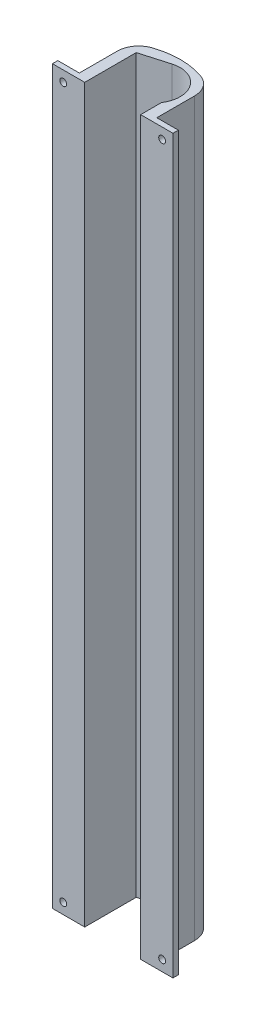
ISO-10303-21;
HEADER;
FILE_DESCRIPTION(('STEP AP214'),'2;1');
FILE_NAME('part.step','',(''),(''),'','','');
FILE_SCHEMA(('AUTOMOTIVE_DESIGN { 1 0 10303 214 1 1 1 1 }'));
ENDSEC;
DATA;
#1=APPLICATION_CONTEXT('core data for automotive mechanical design processes');
#2=APPLICATION_PROTOCOL_DEFINITION('international standard','automotive_design',2000,#1);
#3=PRODUCT_CONTEXT('',#1,'mechanical');
#4=PRODUCT('Part','Part','',(#3));
#5=PRODUCT_RELATED_PRODUCT_CATEGORY('part','',(#4));
#6=PRODUCT_DEFINITION_FORMATION('','',#4);
#7=PRODUCT_DEFINITION_CONTEXT('part definition',#1,'design');
#8=PRODUCT_DEFINITION('design','',#6,#7);
#9=PRODUCT_DEFINITION_SHAPE('','',#8);
#10=(LENGTH_UNIT() NAMED_UNIT(*) SI_UNIT(.MILLI.,.METRE.));
#11=(NAMED_UNIT(*) PLANE_ANGLE_UNIT() SI_UNIT($,.RADIAN.));
#12=(NAMED_UNIT(*) SI_UNIT($,.STERADIAN.) SOLID_ANGLE_UNIT());
#13=UNCERTAINTY_MEASURE_WITH_UNIT(LENGTH_MEASURE(1.E-05),#10,'distance_accuracy_value','');
#14=(GEOMETRIC_REPRESENTATION_CONTEXT(3) GLOBAL_UNCERTAINTY_ASSIGNED_CONTEXT((#13)) GLOBAL_UNIT_ASSIGNED_CONTEXT((#10,
#11,#12)) REPRESENTATION_CONTEXT('',''));
#15=CARTESIAN_POINT('',(0.,0.,0.));
#16=DIRECTION('',(0.,0.,1.));
#17=DIRECTION('',(1.,0.,0.));
#18=AXIS2_PLACEMENT_3D('',#15,#16,#17);
#19=CARTESIAN_POINT('',(0.,431.8,74.9201803451045));
#20=DIRECTION('',(0.,-1.,0.));
#21=DIRECTION('',(0.,0.,-1.));
#22=AXIS2_PLACEMENT_3D('',#19,#20,#21);
#23=CYLINDRICAL_SURFACE('',#22,14.9862811380157);
#24=CARTESIAN_POINT('',(0.,0.,74.9201803451045));
#25=DIRECTION('',(0.,-1.,0.));
#26=DIRECTION('',(0.,0.,-1.));
#27=AXIS2_PLACEMENT_3D('',#24,#25,#26);
#28=CIRCLE('',#27,14.9862811380157);
#29=CARTESIAN_POINT('',(-4.16201958345776,0.,60.5234371253843));
#30=VERTEX_POINT('',#29);
#31=CARTESIAN_POINT('',(12.446,0.,83.2679768416446));
#32=VERTEX_POINT('',#31);
#33=EDGE_CURVE('E168',#30,#32,#28,.T.);
#34=ORIENTED_EDGE('',*,*,#33,.T.);
#35=DIRECTION('',(0.,-1.,0.));
#36=VECTOR('',#35,1.);
#37=CARTESIAN_POINT('',(12.446,431.8,83.2679768416446));
#38=LINE('',#37,#36);
#39=CARTESIAN_POINT('',(12.446,431.8,83.2679768416446));
#40=VERTEX_POINT('',#39);
#41=EDGE_CURVE('E150',#40,#32,#38,.T.);
#42=ORIENTED_EDGE('',*,*,#41,.F.);
#43=CARTESIAN_POINT('',(0.,431.8,74.9201803451045));
#44=DIRECTION('',(0.,-1.,0.));
#45=DIRECTION('',(0.,0.,-1.));
#46=AXIS2_PLACEMENT_3D('',#43,#44,#45);
#47=CIRCLE('',#46,14.9862811380157);
#48=CARTESIAN_POINT('',(-4.16201958345776,431.8,60.5234371253843));
#49=VERTEX_POINT('',#48);
#50=EDGE_CURVE('E156',#49,#40,#47,.T.);
#51=ORIENTED_EDGE('',*,*,#50,.F.);
#52=DIRECTION('',(0.,-1.,0.));
#53=VECTOR('',#52,1.);
#54=CARTESIAN_POINT('',(-4.16201958345776,431.8,60.5234371253843));
#55=LINE('',#54,#53);
#56=EDGE_CURVE('E227',#49,#30,#55,.T.);
#57=ORIENTED_EDGE('',*,*,#56,.T.);
#58=EDGE_LOOP('',(#34,#42,#51,#57));
#59=FACE_BOUND('',#58,.T.);
#60=ADVANCED_FACE('F36',(#59),#23,.F.);
#61=CARTESIAN_POINT('',(12.446,431.8,95.666893232235));
#62=DIRECTION('',(1.,0.,0.));
#63=DIRECTION('',(0.,0.,-1.));
#64=AXIS2_PLACEMENT_3D('',#61,#62,#63);
#65=PLANE('',#64);
#66=DIRECTION('',(0.,0.,1.));
#67=VECTOR('',#66,1.);
#68=CARTESIAN_POINT('',(12.446,0.,95.666893232235));
#69=LINE('',#68,#67);
#70=CARTESIAN_POINT('',(12.446,0.,95.666893232235));
#71=VERTEX_POINT('',#70);
#72=EDGE_CURVE('E258',#32,#71,#69,.T.);
#73=ORIENTED_EDGE('',*,*,#72,.T.);
#74=DIRECTION('',(0.,-1.,0.));
#75=VECTOR('',#74,1.);
#76=CARTESIAN_POINT('',(12.446,431.8,95.666893232235));
#77=LINE('',#76,#75);
#78=CARTESIAN_POINT('',(12.446,431.8,95.666893232235));
#79=VERTEX_POINT('',#78);
#80=EDGE_CURVE('E153',#79,#71,#77,.T.);
#81=ORIENTED_EDGE('',*,*,#80,.F.);
#82=DIRECTION('',(0.,0.,1.));
#83=VECTOR('',#82,1.);
#84=CARTESIAN_POINT('',(12.446,431.8,95.666893232235));
#85=LINE('',#84,#83);
#86=EDGE_CURVE('E146',#40,#79,#85,.T.);
#87=ORIENTED_EDGE('',*,*,#86,.F.);
#88=ORIENTED_EDGE('',*,*,#41,.T.);
#89=EDGE_LOOP('',(#73,#81,#87,#88));
#90=FACE_BOUND('',#89,.T.);
#91=ADVANCED_FACE('F148',(#90),#65,.F.);
#92=CARTESIAN_POINT('',(12.446,431.8,95.666893232235));
#93=DIRECTION('',(0.,0.,-1.));
#94=DIRECTION('',(-1.,0.,0.));
#95=AXIS2_PLACEMENT_3D('',#92,#93,#94);
#96=PLANE('',#95);
#97=CARTESIAN_POINT('',(25.146,6.35,95.666893232235));
#98=DIRECTION('',(0.,0.,-1.));
#99=DIRECTION('',(-1.,0.,0.));
#100=AXIS2_PLACEMENT_3D('',#97,#98,#99);
#101=CIRCLE('',#100,2.03200000000001);
#102=CARTESIAN_POINT('',(23.114,6.35,95.666893232235));
#103=VERTEX_POINT('',#102);
#104=EDGE_CURVE('E282',#103,#103,#101,.T.);
#105=ORIENTED_EDGE('',*,*,#104,.T.);
#106=EDGE_LOOP('',(#105));
#107=FACE_BOUND('',#106,.T.);
#108=CARTESIAN_POINT('',(25.146,425.45,95.666893232235));
#109=DIRECTION('',(0.,0.,-1.));
#110=DIRECTION('',(-1.,0.,0.));
#111=AXIS2_PLACEMENT_3D('',#108,#109,#110);
#112=CIRCLE('',#111,2.03200000000002);
#113=CARTESIAN_POINT('',(23.114,425.45,95.666893232235));
#114=VERTEX_POINT('',#113);
#115=EDGE_CURVE('E263',#114,#114,#112,.T.);
#116=ORIENTED_EDGE('',*,*,#115,.T.);
#117=EDGE_LOOP('',(#116));
#118=FACE_BOUND('',#117,.T.);
#119=DIRECTION('',(1.,0.,0.));
#120=VECTOR('',#119,1.);
#121=CARTESIAN_POINT('',(12.446,0.,95.666893232235));
#122=LINE('',#121,#120);
#123=CARTESIAN_POINT('',(31.496,0.,95.666893232235));
#124=VERTEX_POINT('',#123);
#125=EDGE_CURVE('E257',#71,#124,#122,.T.);
#126=ORIENTED_EDGE('',*,*,#125,.T.);
#127=DIRECTION('',(0.,-1.,0.));
#128=VECTOR('',#127,1.);
#129=CARTESIAN_POINT('',(31.496,431.8,95.666893232235));
#130=LINE('',#129,#128);
#131=CARTESIAN_POINT('',(31.496,431.8,95.666893232235));
#132=VERTEX_POINT('',#131);
#133=EDGE_CURVE('E173',#132,#124,#130,.T.);
#134=ORIENTED_EDGE('',*,*,#133,.F.);
#135=DIRECTION('',(1.,0.,0.));
#136=VECTOR('',#135,1.);
#137=CARTESIAN_POINT('',(12.446,431.8,95.666893232235));
#138=LINE('',#137,#136);
#139=EDGE_CURVE('E155',#79,#132,#138,.T.);
#140=ORIENTED_EDGE('',*,*,#139,.F.);
#141=ORIENTED_EDGE('',*,*,#80,.T.);
#142=EDGE_LOOP('',(#126,#134,#140,#141));
#143=FACE_BOUND('',#142,.T.);
#144=ADVANCED_FACE('F349',(#107,#118,#143),#96,.F.);
#145=CARTESIAN_POINT('',(31.496,431.8,95.666893232235));
#146=DIRECTION('',(-1.,0.,0.));
#147=DIRECTION('',(0.,0.,1.));
#148=AXIS2_PLACEMENT_3D('',#145,#146,#147);
#149=PLANE('',#148);
#150=DIRECTION('',(0.,0.,-1.));
#151=VECTOR('',#150,1.);
#152=CARTESIAN_POINT('',(31.496,0.,95.666893232235));
#153=LINE('',#152,#151);
#154=CARTESIAN_POINT('',(31.496,0.,92.491893232235));
#155=VERTEX_POINT('',#154);
#156=EDGE_CURVE('E212',#124,#155,#153,.T.);
#157=ORIENTED_EDGE('',*,*,#156,.T.);
#158=DIRECTION('',(0.,-1.,0.));
#159=VECTOR('',#158,1.);
#160=CARTESIAN_POINT('',(31.496,431.8,92.491893232235));
#161=LINE('',#160,#159);
#162=CARTESIAN_POINT('',(31.496,431.8,92.491893232235));
#163=VERTEX_POINT('',#162);
#164=EDGE_CURVE('E245',#163,#155,#161,.T.);
#165=ORIENTED_EDGE('',*,*,#164,.F.);
#166=DIRECTION('',(0.,0.,-1.));
#167=VECTOR('',#166,1.);
#168=CARTESIAN_POINT('',(31.496,431.8,95.666893232235));
#169=LINE('',#168,#167);
#170=EDGE_CURVE('E254',#132,#163,#169,.T.);
#171=ORIENTED_EDGE('',*,*,#170,.F.);
#172=ORIENTED_EDGE('',*,*,#133,.T.);
#173=EDGE_LOOP('',(#157,#165,#171,#172));
#174=FACE_BOUND('',#173,.T.);
#175=ADVANCED_FACE('F252',(#174),#149,.F.);
#176=CARTESIAN_POINT('',(31.496,431.8,92.491893232235));
#177=DIRECTION('',(0.,0.,1.));
#178=DIRECTION('',(1.,0.,0.));
#179=AXIS2_PLACEMENT_3D('',#176,#177,#178);
#180=PLANE('',#179);
#181=CARTESIAN_POINT('',(25.146,6.35,92.491893232235));
#182=DIRECTION('',(0.,0.,-1.));
#183=DIRECTION('',(-1.,0.,0.));
#184=AXIS2_PLACEMENT_3D('',#181,#182,#183);
#185=CIRCLE('',#184,2.03200000000001);
#186=CARTESIAN_POINT('',(23.114,6.35,92.491893232235));
#187=VERTEX_POINT('',#186);
#188=EDGE_CURVE('E292',#187,#187,#185,.T.);
#189=ORIENTED_EDGE('',*,*,#188,.F.);
#190=EDGE_LOOP('',(#189));
#191=FACE_BOUND('',#190,.T.);
#192=CARTESIAN_POINT('',(25.146,425.45,92.491893232235));
#193=DIRECTION('',(0.,0.,-1.));
#194=DIRECTION('',(-1.,0.,0.));
#195=AXIS2_PLACEMENT_3D('',#192,#193,#194);
#196=CIRCLE('',#195,2.03200000000002);
#197=CARTESIAN_POINT('',(23.114,425.45,92.491893232235));
#198=VERTEX_POINT('',#197);
#199=EDGE_CURVE('E279',#198,#198,#196,.T.);
#200=ORIENTED_EDGE('',*,*,#199,.F.);
#201=EDGE_LOOP('',(#200));
#202=FACE_BOUND('',#201,.T.);
#203=DIRECTION('',(-1.,0.,0.));
#204=VECTOR('',#203,1.);
#205=CARTESIAN_POINT('',(31.496,0.,92.491893232235));
#206=LINE('',#205,#204);
#207=CARTESIAN_POINT('',(18.796,0.,92.491893232235));
#208=VERTEX_POINT('',#207);
#209=EDGE_CURVE('E208',#155,#208,#206,.T.);
#210=ORIENTED_EDGE('',*,*,#209,.T.);
#211=DIRECTION('',(0.,-1.,0.));
#212=VECTOR('',#211,1.);
#213=CARTESIAN_POINT('',(18.796,431.8,92.491893232235));
#214=LINE('',#213,#212);
#215=CARTESIAN_POINT('',(18.796,431.8,92.491893232235));
#216=VERTEX_POINT('',#215);
#217=EDGE_CURVE('E207',#216,#208,#214,.T.);
#218=ORIENTED_EDGE('',*,*,#217,.F.);
#219=DIRECTION('',(-1.,0.,0.));
#220=VECTOR('',#219,1.);
#221=CARTESIAN_POINT('',(31.496,431.8,92.491893232235));
#222=LINE('',#221,#220);
#223=EDGE_CURVE('E275',#163,#216,#222,.T.);
#224=ORIENTED_EDGE('',*,*,#223,.F.);
#225=ORIENTED_EDGE('',*,*,#164,.T.);
#226=EDGE_LOOP('',(#210,#218,#224,#225));
#227=FACE_BOUND('',#226,.T.);
#228=ADVANCED_FACE('F357',(#191,#202,#227),#180,.F.);
#229=CARTESIAN_POINT('',(18.796,431.8,92.491893232235));
#230=DIRECTION('',(-1.,0.,0.));
#231=DIRECTION('',(0.,0.,1.));
#232=AXIS2_PLACEMENT_3D('',#229,#230,#231);
#233=PLANE('',#232);
#234=DIRECTION('',(0.,0.,-1.));
#235=VECTOR('',#234,1.);
#236=CARTESIAN_POINT('',(18.796,0.,92.491893232235));
#237=LINE('',#236,#235);
#238=CARTESIAN_POINT('',(18.796,0.,70.1337045539244));
#239=VERTEX_POINT('',#238);
#240=EDGE_CURVE('E202',#208,#239,#237,.T.);
#241=ORIENTED_EDGE('',*,*,#240,.T.);
#242=DIRECTION('',(0.,-1.,0.));
#243=VECTOR('',#242,1.);
#244=CARTESIAN_POINT('',(18.796,431.8,70.1337045539244));
#245=LINE('',#244,#243);
#246=CARTESIAN_POINT('',(18.796,431.8,70.1337045539244));
#247=VERTEX_POINT('',#246);
#248=EDGE_CURVE('E59',#239,#247,#245,.F.);
#249=ORIENTED_EDGE('',*,*,#248,.T.);
#250=DIRECTION('',(0.,0.,-1.));
#251=VECTOR('',#250,1.);
#252=CARTESIAN_POINT('',(18.796,431.8,92.491893232235));
#253=LINE('',#252,#251);
#254=EDGE_CURVE('E187',#216,#247,#253,.T.);
#255=ORIENTED_EDGE('',*,*,#254,.F.);
#256=ORIENTED_EDGE('',*,*,#217,.T.);
#257=EDGE_LOOP('',(#241,#249,#255,#256));
#258=FACE_BOUND('',#257,.T.);
#259=ADVANCED_FACE('F205',(#258),#233,.F.);
#260=CARTESIAN_POINT('',(-4.064,431.8,100.214211531035));
#261=DIRECTION('',(0.,-1.,0.));
#262=DIRECTION('',(0.,0.,-1.));
#263=AXIS2_PLACEMENT_3D('',#260,#261,#262);
#264=CYLINDRICAL_SURFACE('',#263,44.45);
#265=CARTESIAN_POINT('',(-4.064,431.8,100.214211531035));
#266=DIRECTION('',(0.,1.,0.));
#267=DIRECTION('',(0.,0.,-1.));
#268=AXIS2_PLACEMENT_3D('',#265,#266,#267);
#269=CIRCLE('',#268,44.45);
#270=CARTESIAN_POINT('',(10.16,431.8,58.1015017630801));
#271=VERTEX_POINT('',#270);
#272=CARTESIAN_POINT('',(-18.288,431.8,58.1015017630801));
#273=VERTEX_POINT('',#272);
#274=EDGE_CURVE('E186',#271,#273,#269,.T.);
#275=ORIENTED_EDGE('',*,*,#274,.F.);
#276=DIRECTION('',(0.,-1.,0.));
#277=VECTOR('',#276,1.);
#278=CARTESIAN_POINT('',(10.16,431.8,58.1015017630801));
#279=LINE('',#278,#277);
#280=CARTESIAN_POINT('',(10.16,0.,58.1015017630801));
#281=VERTEX_POINT('',#280);
#282=EDGE_CURVE('E171',#271,#281,#279,.T.);
#283=ORIENTED_EDGE('',*,*,#282,.T.);
#284=CARTESIAN_POINT('',(-4.064,0.,100.214211531035));
#285=DIRECTION('',(0.,1.,0.));
#286=DIRECTION('',(0.,0.,-1.));
#287=AXIS2_PLACEMENT_3D('',#284,#285,#286);
#288=CIRCLE('',#287,44.45);
#289=CARTESIAN_POINT('',(-18.288,0.,58.1015017630801));
#290=VERTEX_POINT('',#289);
#291=EDGE_CURVE('E203',#281,#290,#288,.T.);
#292=ORIENTED_EDGE('',*,*,#291,.T.);
#293=DIRECTION('',(0.,-1.,0.));
#294=VECTOR('',#293,1.);
#295=CARTESIAN_POINT('',(-18.288,431.8,58.1015017630801));
#296=LINE('',#295,#294);
#297=EDGE_CURVE('E169',#290,#273,#296,.F.);
#298=ORIENTED_EDGE('',*,*,#297,.T.);
#299=EDGE_LOOP('',(#275,#283,#292,#298));
#300=FACE_BOUND('',#299,.T.);
#301=ADVANCED_FACE('F191',(#300),#264,.T.);
#302=CARTESIAN_POINT('',(-26.924,431.8,92.491893232235));
#303=DIRECTION('',(1.,0.,0.));
#304=DIRECTION('',(0.,0.,-1.));
#305=AXIS2_PLACEMENT_3D('',#302,#303,#304);
#306=PLANE('',#305);
#307=DIRECTION('',(0.,0.,1.));
#308=VECTOR('',#307,1.);
#309=CARTESIAN_POINT('',(-26.924,431.8,92.491893232235));
#310=LINE('',#309,#308);
#311=CARTESIAN_POINT('',(-26.924,431.8,70.1337045539244));
#312=VERTEX_POINT('',#311);
#313=CARTESIAN_POINT('',(-26.924,431.8,92.491893232235));
#314=VERTEX_POINT('',#313);
#315=EDGE_CURVE('E195',#312,#314,#310,.T.);
#316=ORIENTED_EDGE('',*,*,#315,.F.);
#317=DIRECTION('',(0.,-1.,0.));
#318=VECTOR('',#317,1.);
#319=CARTESIAN_POINT('',(-26.924,431.8,70.1337045539244));
#320=LINE('',#319,#318);
#321=CARTESIAN_POINT('',(-26.924,0.,70.1337045539244));
#322=VERTEX_POINT('',#321);
#323=EDGE_CURVE('E11',#312,#322,#320,.T.);
#324=ORIENTED_EDGE('',*,*,#323,.T.);
#325=DIRECTION('',(0.,0.,1.));
#326=VECTOR('',#325,1.);
#327=CARTESIAN_POINT('',(-26.924,0.,92.491893232235));
#328=LINE('',#327,#326);
#329=CARTESIAN_POINT('',(-26.924,0.,92.491893232235));
#330=VERTEX_POINT('',#329);
#331=EDGE_CURVE('E210',#322,#330,#328,.T.);
#332=ORIENTED_EDGE('',*,*,#331,.T.);
#333=DIRECTION('',(0.,-1.,0.));
#334=VECTOR('',#333,1.);
#335=CARTESIAN_POINT('',(-26.924,431.8,92.491893232235));
#336=LINE('',#335,#334);
#337=EDGE_CURVE('E241',#314,#330,#336,.T.);
#338=ORIENTED_EDGE('',*,*,#337,.F.);
#339=EDGE_LOOP('',(#316,#324,#332,#338));
#340=FACE_BOUND('',#339,.T.);
#341=ADVANCED_FACE('F317',(#340),#306,.F.);
#342=CARTESIAN_POINT('',(-39.624,431.8,92.491893232235));
#343=DIRECTION('',(0.,0.,1.));
#344=DIRECTION('',(1.,0.,0.));
#345=AXIS2_PLACEMENT_3D('',#342,#343,#344);
#346=PLANE('',#345);
#347=CARTESIAN_POINT('',(-33.2739999999999,425.45,92.491893232235));
#348=DIRECTION('',(0.,0.,-1.));
#349=DIRECTION('',(-1.,0.,0.));
#350=AXIS2_PLACEMENT_3D('',#347,#348,#349);
#351=CIRCLE('',#350,2.03200000000002);
#352=CARTESIAN_POINT('',(-35.3059999999999,425.45,92.491893232235));
#353=VERTEX_POINT('',#352);
#354=EDGE_CURVE('E285',#353,#353,#351,.T.);
#355=ORIENTED_EDGE('',*,*,#354,.F.);
#356=EDGE_LOOP('',(#355));
#357=FACE_BOUND('',#356,.T.);
#358=CARTESIAN_POINT('',(-33.2739999999999,6.35000000000002,92.491893232235));
#359=DIRECTION('',(0.,0.,-1.));
#360=DIRECTION('',(-1.,0.,0.));
#361=AXIS2_PLACEMENT_3D('',#358,#359,#360);
#362=CIRCLE('',#361,2.03200000000001);
#363=CARTESIAN_POINT('',(-35.3059999999999,6.35000000000002,92.491893232235));
#364=VERTEX_POINT('',#363);
#365=EDGE_CURVE('E297',#364,#364,#362,.T.);
#366=ORIENTED_EDGE('',*,*,#365,.F.);
#367=EDGE_LOOP('',(#366));
#368=FACE_BOUND('',#367,.T.);
#369=DIRECTION('',(-1.,0.,0.));
#370=VECTOR('',#369,1.);
#371=CARTESIAN_POINT('',(-39.624,0.,92.491893232235));
#372=LINE('',#371,#370);
#373=CARTESIAN_POINT('',(-39.624,0.,92.491893232235));
#374=VERTEX_POINT('',#373);
#375=EDGE_CURVE('E217',#330,#374,#372,.T.);
#376=ORIENTED_EDGE('',*,*,#375,.T.);
#377=DIRECTION('',(0.,-1.,0.));
#378=VECTOR('',#377,1.);
#379=CARTESIAN_POINT('',(-39.624,431.8,92.491893232235));
#380=LINE('',#379,#378);
#381=CARTESIAN_POINT('',(-39.624,431.8,92.491893232235));
#382=VERTEX_POINT('',#381);
#383=EDGE_CURVE('E238',#382,#374,#380,.T.);
#384=ORIENTED_EDGE('',*,*,#383,.F.);
#385=DIRECTION('',(-1.,0.,0.));
#386=VECTOR('',#385,1.);
#387=CARTESIAN_POINT('',(-39.624,431.8,92.491893232235));
#388=LINE('',#387,#386);
#389=EDGE_CURVE('E271',#314,#382,#388,.T.);
#390=ORIENTED_EDGE('',*,*,#389,.F.);
#391=ORIENTED_EDGE('',*,*,#337,.T.);
#392=EDGE_LOOP('',(#376,#384,#390,#391));
#393=FACE_BOUND('',#392,.T.);
#394=ADVANCED_FACE('F313',(#357,#368,#393),#346,.F.);
#395=CARTESIAN_POINT('',(-39.624,431.8,95.666893232235));
#396=DIRECTION('',(1.,0.,0.));
#397=DIRECTION('',(0.,0.,-1.));
#398=AXIS2_PLACEMENT_3D('',#395,#396,#397);
#399=PLANE('',#398);
#400=DIRECTION('',(0.,0.,1.));
#401=VECTOR('',#400,1.);
#402=CARTESIAN_POINT('',(-39.624,0.,95.666893232235));
#403=LINE('',#402,#401);
#404=CARTESIAN_POINT('',(-39.624,0.,95.666893232235));
#405=VERTEX_POINT('',#404);
#406=EDGE_CURVE('E219',#374,#405,#403,.T.);
#407=ORIENTED_EDGE('',*,*,#406,.T.);
#408=DIRECTION('',(0.,-1.,0.));
#409=VECTOR('',#408,1.);
#410=CARTESIAN_POINT('',(-39.624,431.8,95.666893232235));
#411=LINE('',#410,#409);
#412=CARTESIAN_POINT('',(-39.624,431.8,95.666893232235));
#413=VERTEX_POINT('',#412);
#414=EDGE_CURVE('E235',#413,#405,#411,.T.);
#415=ORIENTED_EDGE('',*,*,#414,.F.);
#416=DIRECTION('',(0.,0.,1.));
#417=VECTOR('',#416,1.);
#418=CARTESIAN_POINT('',(-39.624,431.8,95.666893232235));
#419=LINE('',#418,#417);
#420=EDGE_CURVE('E269',#382,#413,#419,.T.);
#421=ORIENTED_EDGE('',*,*,#420,.F.);
#422=ORIENTED_EDGE('',*,*,#383,.T.);
#423=EDGE_LOOP('',(#407,#415,#421,#422));
#424=FACE_BOUND('',#423,.T.);
#425=ADVANCED_FACE('F316',(#424),#399,.F.);
#426=CARTESIAN_POINT('',(-39.624,431.8,95.666893232235));
#427=DIRECTION('',(0.,0.,-1.));
#428=DIRECTION('',(-1.,0.,0.));
#429=AXIS2_PLACEMENT_3D('',#426,#427,#428);
#430=PLANE('',#429);
#431=CARTESIAN_POINT('',(-33.2739999999999,425.45,95.666893232235));
#432=DIRECTION('',(0.,0.,-1.));
#433=DIRECTION('',(-1.,0.,0.));
#434=AXIS2_PLACEMENT_3D('',#431,#432,#433);
#435=CIRCLE('',#434,2.03200000000002);
#436=CARTESIAN_POINT('',(-35.3059999999999,425.45,95.666893232235));
#437=VERTEX_POINT('',#436);
#438=EDGE_CURVE('E288',#437,#437,#435,.T.);
#439=ORIENTED_EDGE('',*,*,#438,.T.);
#440=EDGE_LOOP('',(#439));
#441=FACE_BOUND('',#440,.T.);
#442=CARTESIAN_POINT('',(-33.2739999999999,6.35000000000002,95.666893232235));
#443=DIRECTION('',(0.,0.,-1.));
#444=DIRECTION('',(-1.,0.,0.));
#445=AXIS2_PLACEMENT_3D('',#442,#443,#444);
#446=CIRCLE('',#445,2.03200000000001);
#447=CARTESIAN_POINT('',(-35.3059999999999,6.35000000000002,95.666893232235));
#448=VERTEX_POINT('',#447);
#449=EDGE_CURVE('E289',#448,#448,#446,.T.);
#450=ORIENTED_EDGE('',*,*,#449,.T.);
#451=EDGE_LOOP('',(#450));
#452=FACE_BOUND('',#451,.T.);
#453=DIRECTION('',(1.,0.,0.));
#454=VECTOR('',#453,1.);
#455=CARTESIAN_POINT('',(-39.624,0.,95.666893232235));
#456=LINE('',#455,#454);
#457=CARTESIAN_POINT('',(-20.574,0.,95.666893232235));
#458=VERTEX_POINT('',#457);
#459=EDGE_CURVE('E221',#405,#458,#456,.T.);
#460=ORIENTED_EDGE('',*,*,#459,.T.);
#461=DIRECTION('',(0.,-1.,0.));
#462=VECTOR('',#461,1.);
#463=CARTESIAN_POINT('',(-20.574,431.8,95.666893232235));
#464=LINE('',#463,#462);
#465=CARTESIAN_POINT('',(-20.574,431.8,95.666893232235));
#466=VERTEX_POINT('',#465);
#467=EDGE_CURVE('E232',#466,#458,#464,.T.);
#468=ORIENTED_EDGE('',*,*,#467,.F.);
#469=DIRECTION('',(1.,0.,0.));
#470=VECTOR('',#469,1.);
#471=CARTESIAN_POINT('',(-39.624,431.8,95.666893232235));
#472=LINE('',#471,#470);
#473=EDGE_CURVE('E267',#413,#466,#472,.T.);
#474=ORIENTED_EDGE('',*,*,#473,.F.);
#475=ORIENTED_EDGE('',*,*,#414,.T.);
#476=EDGE_LOOP('',(#460,#468,#474,#475));
#477=FACE_BOUND('',#476,.T.);
#478=ADVANCED_FACE('F303',(#441,#452,#477),#430,.F.);
#479=CARTESIAN_POINT('',(-20.574,431.8,84.5721803451045));
#480=DIRECTION('',(-1.,0.,0.));
#481=DIRECTION('',(0.,0.,1.));
#482=AXIS2_PLACEMENT_3D('',#479,#480,#481);
#483=PLANE('',#482);
#484=DIRECTION('',(0.,0.,-1.));
#485=VECTOR('',#484,1.);
#486=CARTESIAN_POINT('',(-20.574,0.,84.5721803451045));
#487=LINE('',#486,#485);
#488=CARTESIAN_POINT('',(-20.574,0.,65.2680507407337));
#489=VERTEX_POINT('',#488);
#490=EDGE_CURVE('E224',#458,#489,#487,.T.);
#491=ORIENTED_EDGE('',*,*,#490,.T.);
#492=DIRECTION('',(0.,-1.,0.));
#493=VECTOR('',#492,1.);
#494=CARTESIAN_POINT('',(-20.574,431.8,65.2680507407337));
#495=LINE('',#494,#493);
#496=CARTESIAN_POINT('',(-20.574,431.8,65.2680507407337));
#497=VERTEX_POINT('',#496);
#498=EDGE_CURVE('E229',#497,#489,#495,.T.);
#499=ORIENTED_EDGE('',*,*,#498,.F.);
#500=DIRECTION('',(0.,0.,-1.));
#501=VECTOR('',#500,1.);
#502=CARTESIAN_POINT('',(-20.574,431.8,84.5721803451045));
#503=LINE('',#502,#501);
#504=EDGE_CURVE('E265',#466,#497,#503,.T.);
#505=ORIENTED_EDGE('',*,*,#504,.F.);
#506=ORIENTED_EDGE('',*,*,#467,.T.);
#507=EDGE_LOOP('',(#491,#499,#505,#506));
#508=FACE_BOUND('',#507,.T.);
#509=ADVANCED_FACE('F335',(#508),#483,.F.);
#510=CARTESIAN_POINT('',(-20.574,431.8,65.2680507407337));
#511=DIRECTION('',(-0.27772197419278,0.,-0.960661493477523));
#512=DIRECTION('',(-0.960661493477523,0.,0.27772197419278));
#513=AXIS2_PLACEMENT_3D('',#510,#511,#512);
#514=PLANE('',#513);
#515=DIRECTION('',(0.960661493477523,0.,-0.27772197419278));
#516=VECTOR('',#515,1.);
#517=CARTESIAN_POINT('',(-20.574,0.,65.2680507407337));
#518=LINE('',#517,#516);
#519=EDGE_CURVE('E165',#489,#30,#518,.T.);
#520=ORIENTED_EDGE('',*,*,#519,.T.);
#521=ORIENTED_EDGE('',*,*,#56,.F.);
#522=DIRECTION('',(0.960661493477523,0.,-0.27772197419278));
#523=VECTOR('',#522,1.);
#524=CARTESIAN_POINT('',(-20.574,431.8,65.2680507407337));
#525=LINE('',#524,#523);
#526=EDGE_CURVE('E161',#497,#49,#525,.T.);
#527=ORIENTED_EDGE('',*,*,#526,.F.);
#528=ORIENTED_EDGE('',*,*,#498,.T.);
#529=EDGE_LOOP('',(#520,#521,#527,#528));
#530=FACE_BOUND('',#529,.T.);
#531=ADVANCED_FACE('F374',(#530),#514,.F.);
#532=CARTESIAN_POINT('',(0.,431.8,74.9201803451045));
#533=DIRECTION('',(0.,-1.,0.));
#534=DIRECTION('',(0.,0.,-1.));
#535=AXIS2_PLACEMENT_3D('',#532,#533,#534);
#536=PLANE('',#535);
#537=ORIENTED_EDGE('',*,*,#254,.T.);
#538=CARTESIAN_POINT('',(6.09599999999999,431.8,70.1337045539244));
#539=DIRECTION('',(0.,-1.,0.));
#540=DIRECTION('',(0.,0.,-1.));
#541=AXIS2_PLACEMENT_3D('',#538,#539,#540);
#542=CIRCLE('',#541,12.7);
#543=EDGE_CURVE('E44',#247,#271,#542,.F.);
#544=ORIENTED_EDGE('',*,*,#543,.T.);
#545=ORIENTED_EDGE('',*,*,#274,.T.);
#546=CARTESIAN_POINT('',(-14.224,431.8,70.1337045539244));
#547=DIRECTION('',(0.,-1.,0.));
#548=DIRECTION('',(0.,0.,-1.));
#549=AXIS2_PLACEMENT_3D('',#546,#547,#548);
#550=CIRCLE('',#549,12.7);
#551=EDGE_CURVE('E51',#273,#312,#550,.F.);
#552=ORIENTED_EDGE('',*,*,#551,.T.);
#553=ORIENTED_EDGE('',*,*,#315,.T.);
#554=ORIENTED_EDGE('',*,*,#389,.T.);
#555=ORIENTED_EDGE('',*,*,#420,.T.);
#556=ORIENTED_EDGE('',*,*,#473,.T.);
#557=ORIENTED_EDGE('',*,*,#504,.T.);
#558=ORIENTED_EDGE('',*,*,#526,.T.);
#559=ORIENTED_EDGE('',*,*,#50,.T.);
#560=ORIENTED_EDGE('',*,*,#86,.T.);
#561=ORIENTED_EDGE('',*,*,#139,.T.);
#562=ORIENTED_EDGE('',*,*,#170,.T.);
#563=ORIENTED_EDGE('',*,*,#223,.T.);
#564=EDGE_LOOP('',(#537,#544,#545,#552,#553,#554,#555,#556,#557,#558,#559,#560,#561,#562,#563));
#565=FACE_BOUND('',#564,.T.);
#566=ADVANCED_FACE('F159',(#565),#536,.F.);
#567=CARTESIAN_POINT('',(0.,0.,74.9201803451045));
#568=DIRECTION('',(0.,-1.,0.));
#569=DIRECTION('',(0.,0.,-1.));
#570=AXIS2_PLACEMENT_3D('',#567,#568,#569);
#571=PLANE('',#570);
#572=ORIENTED_EDGE('',*,*,#291,.F.);
#573=CARTESIAN_POINT('',(6.09599999999999,0.,70.1337045539244));
#574=DIRECTION('',(0.,-1.,0.));
#575=DIRECTION('',(0.,0.,-1.));
#576=AXIS2_PLACEMENT_3D('',#573,#574,#575);
#577=CIRCLE('',#576,12.7);
#578=EDGE_CURVE('E181',#281,#239,#577,.T.);
#579=ORIENTED_EDGE('',*,*,#578,.T.);
#580=ORIENTED_EDGE('',*,*,#240,.F.);
#581=ORIENTED_EDGE('',*,*,#209,.F.);
#582=ORIENTED_EDGE('',*,*,#156,.F.);
#583=ORIENTED_EDGE('',*,*,#125,.F.);
#584=ORIENTED_EDGE('',*,*,#72,.F.);
#585=ORIENTED_EDGE('',*,*,#33,.F.);
#586=ORIENTED_EDGE('',*,*,#519,.F.);
#587=ORIENTED_EDGE('',*,*,#490,.F.);
#588=ORIENTED_EDGE('',*,*,#459,.F.);
#589=ORIENTED_EDGE('',*,*,#406,.F.);
#590=ORIENTED_EDGE('',*,*,#375,.F.);
#591=ORIENTED_EDGE('',*,*,#331,.F.);
#592=CARTESIAN_POINT('',(-14.224,0.,70.1337045539244));
#593=DIRECTION('',(0.,-1.,0.));
#594=DIRECTION('',(0.,0.,-1.));
#595=AXIS2_PLACEMENT_3D('',#592,#593,#594);
#596=CIRCLE('',#595,12.7);
#597=EDGE_CURVE('E179',#322,#290,#596,.T.);
#598=ORIENTED_EDGE('',*,*,#597,.T.);
#599=EDGE_LOOP('',(#572,#579,#580,#581,#582,#583,#584,#585,#586,#587,#588,#589,#590,#591,#598));
#600=FACE_BOUND('',#599,.T.);
#601=ADVANCED_FACE('F200',(#600),#571,.T.);
#602=CARTESIAN_POINT('',(6.09599999999999,431.8,70.1337045539244));
#603=DIRECTION('',(0.,-1.,0.));
#604=DIRECTION('',(0.,0.,-1.));
#605=AXIS2_PLACEMENT_3D('',#602,#603,#604);
#606=CYLINDRICAL_SURFACE('',#605,12.7);
#607=ORIENTED_EDGE('',*,*,#543,.F.);
#608=ORIENTED_EDGE('',*,*,#248,.F.);
#609=ORIENTED_EDGE('',*,*,#578,.F.);
#610=ORIENTED_EDGE('',*,*,#282,.F.);
#611=EDGE_LOOP('',(#607,#608,#609,#610));
#612=FACE_BOUND('',#611,.T.);
#613=ADVANCED_FACE('F197',(#612),#606,.T.);
#614=CARTESIAN_POINT('',(-14.224,431.8,70.1337045539244));
#615=DIRECTION('',(0.,-1.,0.));
#616=DIRECTION('',(0.,0.,-1.));
#617=AXIS2_PLACEMENT_3D('',#614,#615,#616);
#618=CYLINDRICAL_SURFACE('',#617,12.7);
#619=ORIENTED_EDGE('',*,*,#551,.F.);
#620=ORIENTED_EDGE('',*,*,#297,.F.);
#621=ORIENTED_EDGE('',*,*,#597,.F.);
#622=ORIENTED_EDGE('',*,*,#323,.F.);
#623=EDGE_LOOP('',(#619,#620,#621,#622));
#624=FACE_BOUND('',#623,.T.);
#625=ADVANCED_FACE('F38',(#624),#618,.T.);
#626=CARTESIAN_POINT('',(-33.2739999999999,6.35000000000002,95.666893232235));
#627=DIRECTION('',(0.,0.,-1.));
#628=DIRECTION('',(-1.,0.,0.));
#629=AXIS2_PLACEMENT_3D('',#626,#627,#628);
#630=CYLINDRICAL_SURFACE('',#629,2.03200000000001);
#631=ORIENTED_EDGE('',*,*,#449,.F.);
#632=EDGE_LOOP('',(#631));
#633=FACE_BOUND('',#632,.T.);
#634=ORIENTED_EDGE('',*,*,#365,.T.);
#635=EDGE_LOOP('',(#634));
#636=FACE_BOUND('',#635,.T.);
#637=ADVANCED_FACE('F306',(#633,#636),#630,.F.);
#638=CARTESIAN_POINT('',(-33.2739999999999,425.45,95.666893232235));
#639=DIRECTION('',(0.,0.,-1.));
#640=DIRECTION('',(-1.,0.,0.));
#641=AXIS2_PLACEMENT_3D('',#638,#639,#640);
#642=CYLINDRICAL_SURFACE('',#641,2.03200000000002);
#643=ORIENTED_EDGE('',*,*,#438,.F.);
#644=EDGE_LOOP('',(#643));
#645=FACE_BOUND('',#644,.T.);
#646=ORIENTED_EDGE('',*,*,#354,.T.);
#647=EDGE_LOOP('',(#646));
#648=FACE_BOUND('',#647,.T.);
#649=ADVANCED_FACE('F309',(#645,#648),#642,.F.);
#650=CARTESIAN_POINT('',(25.146,425.45,95.666893232235));
#651=DIRECTION('',(0.,0.,-1.));
#652=DIRECTION('',(-1.,0.,0.));
#653=AXIS2_PLACEMENT_3D('',#650,#651,#652);
#654=CYLINDRICAL_SURFACE('',#653,2.03200000000002);
#655=ORIENTED_EDGE('',*,*,#115,.F.);
#656=EDGE_LOOP('',(#655));
#657=FACE_BOUND('',#656,.T.);
#658=ORIENTED_EDGE('',*,*,#199,.T.);
#659=EDGE_LOOP('',(#658));
#660=FACE_BOUND('',#659,.T.);
#661=ADVANCED_FACE('F382',(#657,#660),#654,.F.);
#662=CARTESIAN_POINT('',(25.146,6.35,95.666893232235));
#663=DIRECTION('',(0.,0.,-1.));
#664=DIRECTION('',(-1.,0.,0.));
#665=AXIS2_PLACEMENT_3D('',#662,#663,#664);
#666=CYLINDRICAL_SURFACE('',#665,2.03200000000001);
#667=ORIENTED_EDGE('',*,*,#104,.F.);
#668=EDGE_LOOP('',(#667));
#669=FACE_BOUND('',#668,.T.);
#670=ORIENTED_EDGE('',*,*,#188,.T.);
#671=EDGE_LOOP('',(#670));
#672=FACE_BOUND('',#671,.T.);
#673=ADVANCED_FACE('F385',(#669,#672),#666,.F.);
#674=CLOSED_SHELL('',(#60,#91,#144,#175,#228,#259,#301,#341,#394,#425,#478,#509,#531,#566,#601,
#613,#625,#637,#649,#661,#673));
#675=MANIFOLD_SOLID_BREP('B2',#674);
#676=ADVANCED_BREP_SHAPE_REPRESENTATION('',(#18,#675),#14);
#677=SHAPE_DEFINITION_REPRESENTATION(#9,#676);
ENDSEC;
END-ISO-10303-21;
